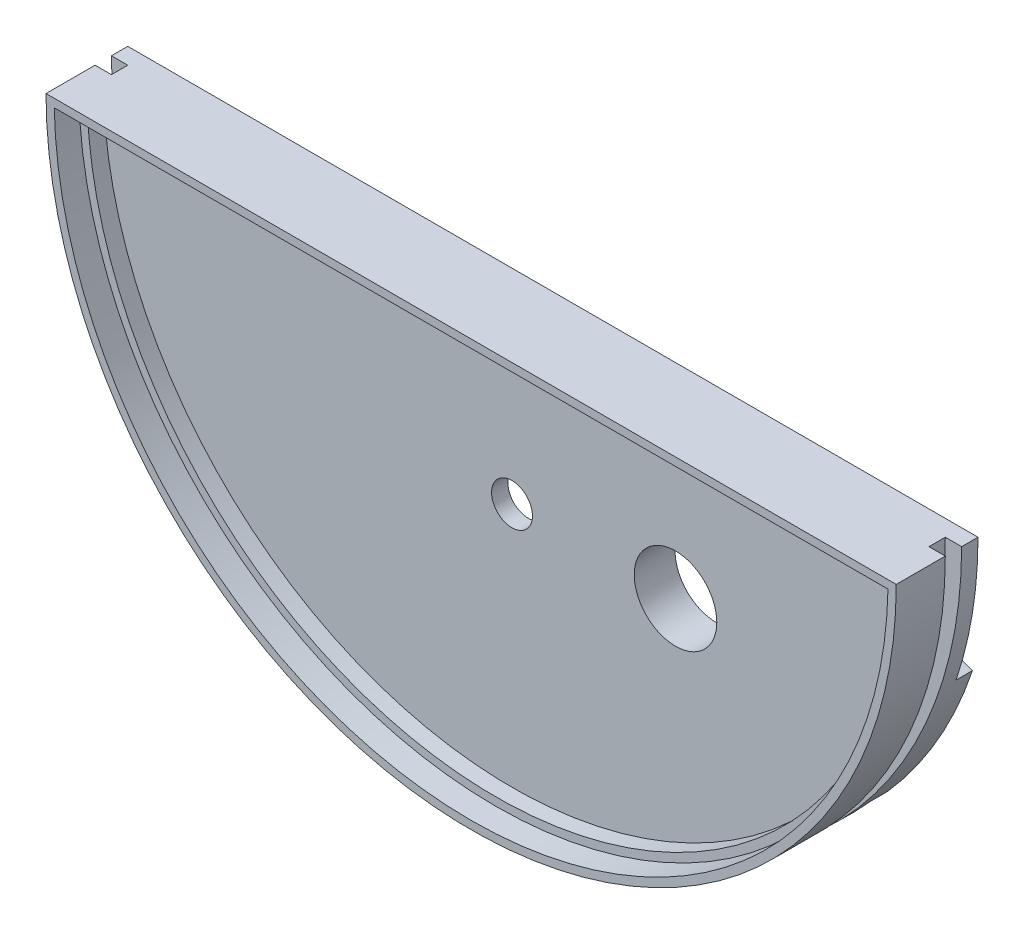
ISO-10303-21;
HEADER;
FILE_DESCRIPTION(('STEP AP214'),'2;1');
FILE_NAME('part.step','',(''),(''),'','','');
FILE_SCHEMA(('AUTOMOTIVE_DESIGN { 1 0 10303 214 1 1 1 1 }'));
ENDSEC;
DATA;
#1=APPLICATION_CONTEXT('core data for automotive mechanical design processes');
#2=APPLICATION_PROTOCOL_DEFINITION('international standard','automotive_design',2000,#1);
#3=PRODUCT_CONTEXT('',#1,'mechanical');
#4=PRODUCT('Part','Part','',(#3));
#5=PRODUCT_RELATED_PRODUCT_CATEGORY('part','',(#4));
#6=PRODUCT_DEFINITION_FORMATION('','',#4);
#7=PRODUCT_DEFINITION_CONTEXT('part definition',#1,'design');
#8=PRODUCT_DEFINITION('design','',#6,#7);
#9=PRODUCT_DEFINITION_SHAPE('','',#8);
#10=(LENGTH_UNIT() NAMED_UNIT(*) SI_UNIT(.MILLI.,.METRE.));
#11=(NAMED_UNIT(*) PLANE_ANGLE_UNIT() SI_UNIT($,.RADIAN.));
#12=(NAMED_UNIT(*) SI_UNIT($,.STERADIAN.) SOLID_ANGLE_UNIT());
#13=UNCERTAINTY_MEASURE_WITH_UNIT(LENGTH_MEASURE(1.E-05),#10,'distance_accuracy_value','');
#14=(GEOMETRIC_REPRESENTATION_CONTEXT(3) GLOBAL_UNCERTAINTY_ASSIGNED_CONTEXT((#13)) GLOBAL_UNIT_ASSIGNED_CONTEXT((#10,
#11,#12)) REPRESENTATION_CONTEXT('',''));
#15=CARTESIAN_POINT('',(0.,0.,0.));
#16=DIRECTION('',(0.,0.,1.));
#17=DIRECTION('',(1.,0.,0.));
#18=AXIS2_PLACEMENT_3D('',#15,#16,#17);
#19=CARTESIAN_POINT('',(0.,0.,-5.));
#20=DIRECTION('',(0.,0.,1.));
#21=DIRECTION('',(1.,0.,0.));
#22=AXIS2_PLACEMENT_3D('',#19,#20,#21);
#23=CYLINDRICAL_SURFACE('',#22,52.);
#24=DIRECTION('',(0.,0.,1.));
#25=VECTOR('',#24,1.);
#26=CARTESIAN_POINT('',(-52.,0.,-5.));
#27=LINE('',#26,#25);
#28=CARTESIAN_POINT('',(-52.,0.,-1.));
#29=VERTEX_POINT('',#28);
#30=CARTESIAN_POINT('',(-52.,0.,5.));
#31=VERTEX_POINT('',#30);
#32=EDGE_CURVE('E357',#29,#31,#27,.T.);
#33=ORIENTED_EDGE('',*,*,#32,.F.);
#34=CARTESIAN_POINT('',(0.,0.,-1.));
#35=DIRECTION('',(0.,0.,-1.));
#36=DIRECTION('',(-1.,0.,0.));
#37=AXIS2_PLACEMENT_3D('',#34,#35,#36);
#38=CIRCLE('',#37,52.);
#39=CARTESIAN_POINT('',(52.,0.,-1.));
#40=VERTEX_POINT('',#39);
#41=EDGE_CURVE('E51',#29,#40,#38,.F.);
#42=ORIENTED_EDGE('',*,*,#41,.T.);
#43=DIRECTION('',(0.,0.,1.));
#44=VECTOR('',#43,1.);
#45=CARTESIAN_POINT('',(52.,0.,-5.));
#46=LINE('',#45,#44);
#47=CARTESIAN_POINT('',(52.,0.,5.));
#48=VERTEX_POINT('',#47);
#49=EDGE_CURVE('E358',#40,#48,#46,.T.);
#50=ORIENTED_EDGE('',*,*,#49,.T.);
#51=CARTESIAN_POINT('',(0.,0.,5.));
#52=DIRECTION('',(0.,0.,1.));
#53=DIRECTION('',(1.,0.,0.));
#54=AXIS2_PLACEMENT_3D('',#51,#52,#53);
#55=CIRCLE('',#54,52.);
#56=EDGE_CURVE('E375',#31,#48,#55,.T.);
#57=ORIENTED_EDGE('',*,*,#56,.F.);
#58=EDGE_LOOP('',(#33,#42,#50,#57));
#59=FACE_BOUND('',#58,.T.);
#60=ADVANCED_FACE('F35',(#59),#23,.T.);
#61=CARTESIAN_POINT('',(0.,0.,5.));
#62=DIRECTION('',(0.,0.,-1.));
#63=DIRECTION('',(-1.,0.,0.));
#64=AXIS2_PLACEMENT_3D('',#61,#62,#63);
#65=CYLINDRICAL_SURFACE('',#64,50.);
#66=DIRECTION('',(0.,0.,-1.));
#67=VECTOR('',#66,1.);
#68=CARTESIAN_POINT('',(-49.9599839871872,-2.00000000000002,5.));
#69=LINE('',#68,#67);
#70=CARTESIAN_POINT('',(-49.9599839871872,-2.00000000000002,2.));
#71=VERTEX_POINT('',#70);
#72=CARTESIAN_POINT('',(-49.9599839871872,-2.00000000000002,0.));
#73=VERTEX_POINT('',#72);
#74=EDGE_CURVE('E379',#71,#73,#69,.T.);
#75=ORIENTED_EDGE('',*,*,#74,.F.);
#76=CARTESIAN_POINT('',(0.,0.,2.));
#77=DIRECTION('',(0.,0.,1.));
#78=DIRECTION('',(1.,0.,0.));
#79=AXIS2_PLACEMENT_3D('',#76,#77,#78);
#80=CIRCLE('',#79,50.);
#81=CARTESIAN_POINT('',(49.9599839871872,-2.,2.));
#82=VERTEX_POINT('',#81);
#83=EDGE_CURVE('E225',#71,#82,#80,.T.);
#84=ORIENTED_EDGE('',*,*,#83,.T.);
#85=DIRECTION('',(0.,0.,-1.));
#86=VECTOR('',#85,1.);
#87=CARTESIAN_POINT('',(49.9599839871872,-2.,5.));
#88=LINE('',#87,#86);
#89=CARTESIAN_POINT('',(49.9599839871872,-2.,0.));
#90=VERTEX_POINT('',#89);
#91=EDGE_CURVE('E377',#82,#90,#88,.T.);
#92=ORIENTED_EDGE('',*,*,#91,.T.);
#93=CARTESIAN_POINT('',(0.,0.,0.));
#94=DIRECTION('',(0.,0.,1.));
#95=DIRECTION('',(1.,0.,0.));
#96=AXIS2_PLACEMENT_3D('',#93,#94,#95);
#97=CIRCLE('',#96,50.);
#98=EDGE_CURVE('E470',#73,#90,#97,.T.);
#99=ORIENTED_EDGE('',*,*,#98,.F.);
#100=EDGE_LOOP('',(#75,#84,#92,#99));
#101=FACE_BOUND('',#100,.T.);
#102=ADVANCED_FACE('F405',(#101),#65,.F.);
#103=CARTESIAN_POINT('',(49.9599839871872,-2.,5.));
#104=DIRECTION('',(0.,-1.,0.));
#105=DIRECTION('',(1.,0.,0.));
#106=AXIS2_PLACEMENT_3D('',#103,#104,#105);
#107=PLANE('',#106);
#108=ORIENTED_EDGE('',*,*,#91,.F.);
#109=DIRECTION('',(-1.,0.,0.));
#110=VECTOR('',#109,1.);
#111=CARTESIAN_POINT('',(49.9599839871872,-2.,2.));
#112=LINE('',#111,#110);
#113=EDGE_CURVE('E364',#82,#71,#112,.T.);
#114=ORIENTED_EDGE('',*,*,#113,.T.);
#115=ORIENTED_EDGE('',*,*,#74,.T.);
#116=DIRECTION('',(-1.,0.,0.));
#117=VECTOR('',#116,1.);
#118=CARTESIAN_POINT('',(49.9599839871872,-2.,0.));
#119=LINE('',#118,#117);
#120=EDGE_CURVE('E492',#90,#73,#119,.T.);
#121=ORIENTED_EDGE('',*,*,#120,.F.);
#122=EDGE_LOOP('',(#108,#114,#115,#121));
#123=FACE_BOUND('',#122,.T.);
#124=ADVANCED_FACE('F409',(#123),#107,.T.);
#125=CARTESIAN_POINT('',(0.,0.,-5.));
#126=DIRECTION('',(0.,0.,1.));
#127=DIRECTION('',(1.,0.,0.));
#128=AXIS2_PLACEMENT_3D('',#125,#126,#127);
#129=PLANE('',#128);
#130=DIRECTION('',(-0.748528137423872,-0.663103029313507,0.));
#131=VECTOR('',#130,1.);
#132=CARTESIAN_POINT('',(7.03983839868184E-13,-7.94675471440051E-13,-5.));
#133=LINE('',#132,#131);
#134=CARTESIAN_POINT('',(-37.4264068711929,-33.1551514656761,-5.));
#135=VERTEX_POINT('',#134);
#136=CARTESIAN_POINT('',(-38.9234631460406,-34.4813575243032,-5.));
#137=VERTEX_POINT('',#136);
#138=EDGE_CURVE('E259',#135,#137,#133,.T.);
#139=ORIENTED_EDGE('',*,*,#138,.F.);
#140=CARTESIAN_POINT('',(0.,0.,-5.));
#141=DIRECTION('',(0.,0.,-1.));
#142=DIRECTION('',(-1.,0.,0.));
#143=AXIS2_PLACEMENT_3D('',#140,#141,#142);
#144=CIRCLE('',#143,50.);
#145=CARTESIAN_POINT('',(-47.4264068711929,-15.8346433899874,-5.));
#146=VERTEX_POINT('',#145);
#147=EDGE_CURVE('E242',#135,#146,#144,.T.);
#148=ORIENTED_EDGE('',*,*,#147,.T.);
#149=DIRECTION('',(-0.948528137423857,-0.316692867799747,0.));
#150=VECTOR('',#149,1.);
#151=CARTESIAN_POINT('',(0.,0.,-5.));
#152=LINE('',#151,#150);
#153=CARTESIAN_POINT('',(-49.3234631460406,-16.4680291255868,-5.));
#154=VERTEX_POINT('',#153);
#155=EDGE_CURVE('E249',#146,#154,#152,.T.);
#156=ORIENTED_EDGE('',*,*,#155,.T.);
#157=CARTESIAN_POINT('',(0.,0.,-5.));
#158=DIRECTION('',(0.,0.,1.));
#159=DIRECTION('',(1.,0.,0.));
#160=AXIS2_PLACEMENT_3D('',#157,#158,#159);
#161=CIRCLE('',#160,52.);
#162=CARTESIAN_POINT('',(-52.,0.,-5.));
#163=VERTEX_POINT('',#162);
#164=EDGE_CURVE('E353',#163,#154,#161,.T.);
#165=ORIENTED_EDGE('',*,*,#164,.F.);
#166=DIRECTION('',(-1.,0.,0.));
#167=VECTOR('',#166,1.);
#168=CARTESIAN_POINT('',(-52.,0.,-5.));
#169=LINE('',#168,#167);
#170=CARTESIAN_POINT('',(52.,0.,-5.));
#171=VERTEX_POINT('',#170);
#172=EDGE_CURVE('E348',#171,#163,#169,.T.);
#173=ORIENTED_EDGE('',*,*,#172,.F.);
#174=CARTESIAN_POINT('',(49.3234631460406,-16.4680291255869,-5.));
#175=VERTEX_POINT('',#174);
#176=EDGE_CURVE('E321',#175,#171,#161,.T.);
#177=ORIENTED_EDGE('',*,*,#176,.F.);
#178=DIRECTION('',(0.948528137423855,-0.316692867799755,0.));
#179=VECTOR('',#178,1.);
#180=CARTESIAN_POINT('',(1.18664903328477E-13,3.55413749964563E-13,-5.));
#181=LINE('',#180,#179);
#182=CARTESIAN_POINT('',(47.4264068711928,-15.8346433899874,-5.));
#183=VERTEX_POINT('',#182);
#184=EDGE_CURVE('E313',#183,#175,#181,.T.);
#185=ORIENTED_EDGE('',*,*,#184,.F.);
#186=CARTESIAN_POINT('',(0.,0.,-5.));
#187=DIRECTION('',(0.,0.,-1.));
#188=DIRECTION('',(-1.,0.,0.));
#189=AXIS2_PLACEMENT_3D('',#186,#187,#188);
#190=CIRCLE('',#189,50.);
#191=CARTESIAN_POINT('',(37.4264068711928,-33.1551514656762,-5.));
#192=VERTEX_POINT('',#191);
#193=EDGE_CURVE('E299',#183,#192,#190,.T.);
#194=ORIENTED_EDGE('',*,*,#193,.T.);
#195=DIRECTION('',(0.748528137423853,-0.663103029313527,0.));
#196=VECTOR('',#195,1.);
#197=CARTESIAN_POINT('',(1.7484565957511E-13,1.9737037852759E-13,-5.));
#198=LINE('',#197,#196);
#199=CARTESIAN_POINT('',(38.9234631460406,-34.4813575243032,-5.));
#200=VERTEX_POINT('',#199);
#201=EDGE_CURVE('E304',#192,#200,#198,.T.);
#202=ORIENTED_EDGE('',*,*,#201,.T.);
#203=CARTESIAN_POINT('',(10.4,-50.9493866498901,-5.));
#204=VERTEX_POINT('',#203);
#205=EDGE_CURVE('E339',#204,#200,#161,.T.);
#206=ORIENTED_EDGE('',*,*,#205,.F.);
#207=DIRECTION('',(0.199999999999982,-0.979795897113275,0.));
#208=VECTOR('',#207,1.);
#209=CARTESIAN_POINT('',(8.8383097108184E-13,1.80411241501572E-13,-5.));
#210=LINE('',#209,#208);
#211=CARTESIAN_POINT('',(10.,-48.9897948556635,-5.));
#212=VERTEX_POINT('',#211);
#213=EDGE_CURVE('E286',#212,#204,#210,.T.);
#214=ORIENTED_EDGE('',*,*,#213,.F.);
#215=CARTESIAN_POINT('',(0.,0.,-5.));
#216=DIRECTION('',(0.,0.,-1.));
#217=DIRECTION('',(-1.,0.,0.));
#218=AXIS2_PLACEMENT_3D('',#215,#216,#217);
#219=CIRCLE('',#218,50.);
#220=CARTESIAN_POINT('',(-10.,-48.9897948556636,-5.));
#221=VERTEX_POINT('',#220);
#222=EDGE_CURVE('E271',#212,#221,#219,.T.);
#223=ORIENTED_EDGE('',*,*,#222,.T.);
#224=DIRECTION('',(-0.200000000000004,-0.97979589711327,0.));
#225=VECTOR('',#224,1.);
#226=CARTESIAN_POINT('',(1.93762943660249E-13,0.,-5.));
#227=LINE('',#226,#225);
#228=CARTESIAN_POINT('',(-10.4,-50.9493866498901,-5.));
#229=VERTEX_POINT('',#228);
#230=EDGE_CURVE('E276',#221,#229,#227,.T.);
#231=ORIENTED_EDGE('',*,*,#230,.T.);
#232=EDGE_CURVE('E341',#137,#229,#161,.T.);
#233=ORIENTED_EDGE('',*,*,#232,.F.);
#234=EDGE_LOOP('',(#139,#148,#156,#165,#173,#177,#185,#194,#202,#206,#214,#223,#231,#233));
#235=FACE_BOUND('',#234,.T.);
#236=CARTESIAN_POINT('',(20.,-20.,-5.));
#237=DIRECTION('',(0.,0.,1.));
#238=DIRECTION('',(1.,0.,0.));
#239=AXIS2_PLACEMENT_3D('',#236,#237,#238);
#240=CIRCLE('',#239,5.05);
#241=CARTESIAN_POINT('',(25.05,-20.,-5.));
#242=VERTEX_POINT('',#241);
#243=EDGE_CURVE('E382',#242,#242,#240,.T.);
#244=ORIENTED_EDGE('',*,*,#243,.T.);
#245=EDGE_LOOP('',(#244));
#246=FACE_BOUND('',#245,.T.);
#247=CARTESIAN_POINT('',(0.,-20.,-5.));
#248=DIRECTION('',(0.,0.,-1.));
#249=DIRECTION('',(-1.,0.,0.));
#250=AXIS2_PLACEMENT_3D('',#247,#248,#249);
#251=CIRCLE('',#250,9.5);
#252=CARTESIAN_POINT('',(-9.5,-20.,-5.));
#253=VERTEX_POINT('',#252);
#254=EDGE_CURVE('E238',#253,#253,#251,.T.);
#255=ORIENTED_EDGE('',*,*,#254,.F.);
#256=EDGE_LOOP('',(#255));
#257=FACE_BOUND('',#256,.T.);
#258=CARTESIAN_POINT('',(-20.,-20.,-5.));
#259=DIRECTION('',(0.,0.,1.));
#260=DIRECTION('',(1.,0.,0.));
#261=AXIS2_PLACEMENT_3D('',#258,#259,#260);
#262=CIRCLE('',#261,5.);
#263=CARTESIAN_POINT('',(-15.,-20.,-5.));
#264=VERTEX_POINT('',#263);
#265=EDGE_CURVE('E361',#264,#264,#262,.F.);
#266=ORIENTED_EDGE('',*,*,#265,.F.);
#267=EDGE_LOOP('',(#266));
#268=FACE_BOUND('',#267,.T.);
#269=ADVANCED_FACE('F413',(#235,#246,#257,#268),#129,.F.);
#270=CARTESIAN_POINT('',(0.,0.,-3.));
#271=DIRECTION('',(0.,0.,-1.));
#272=DIRECTION('',(-1.,0.,0.));
#273=AXIS2_PLACEMENT_3D('',#270,#271,#272);
#274=CIRCLE('',#273,52.);
#275=CARTESIAN_POINT('',(-52.,3.63114059239686E-13,-3.));
#276=VERTEX_POINT('',#275);
#277=CARTESIAN_POINT('',(52.,0.,-3.));
#278=VERTEX_POINT('',#277);
#279=EDGE_CURVE('E188',#276,#278,#274,.F.);
#280=ORIENTED_EDGE('',*,*,#279,.F.);
#281=EDGE_CURVE('E359',#163,#276,#27,.T.);
#282=ORIENTED_EDGE('',*,*,#281,.F.);
#283=ORIENTED_EDGE('',*,*,#164,.T.);
#284=DIRECTION('',(0.,0.,1.));
#285=VECTOR('',#284,1.);
#286=CARTESIAN_POINT('',(-49.3234631460406,-16.4680291255868,-7.));
#287=LINE('',#286,#285);
#288=CARTESIAN_POINT('',(-49.3234631460406,-16.4680291255868,-7.));
#289=VERTEX_POINT('',#288);
#290=EDGE_CURVE('E265',#289,#154,#287,.T.);
#291=ORIENTED_EDGE('',*,*,#290,.F.);
#292=CARTESIAN_POINT('',(0.,0.,-7.));
#293=DIRECTION('',(0.,0.,-1.));
#294=DIRECTION('',(-1.,0.,0.));
#295=AXIS2_PLACEMENT_3D('',#292,#293,#294);
#296=CIRCLE('',#295,52.);
#297=CARTESIAN_POINT('',(-38.9234631460406,-34.4813575243032,-7.));
#298=VERTEX_POINT('',#297);
#299=EDGE_CURVE('E251',#298,#289,#296,.T.);
#300=ORIENTED_EDGE('',*,*,#299,.F.);
#301=DIRECTION('',(0.,0.,1.));
#302=VECTOR('',#301,1.);
#303=CARTESIAN_POINT('',(-38.9234631460406,-34.4813575243032,-7.));
#304=LINE('',#303,#302);
#305=EDGE_CURVE('E267',#298,#137,#304,.T.);
#306=ORIENTED_EDGE('',*,*,#305,.T.);
#307=ORIENTED_EDGE('',*,*,#232,.T.);
#308=DIRECTION('',(0.,0.,1.));
#309=VECTOR('',#308,1.);
#310=CARTESIAN_POINT('',(-10.4,-50.9493866498901,-7.));
#311=LINE('',#310,#309);
#312=CARTESIAN_POINT('',(-10.4,-50.9493866498901,-7.));
#313=VERTEX_POINT('',#312);
#314=EDGE_CURVE('E291',#313,#229,#311,.T.);
#315=ORIENTED_EDGE('',*,*,#314,.F.);
#316=CARTESIAN_POINT('',(0.,0.,-7.));
#317=DIRECTION('',(0.,0.,-1.));
#318=DIRECTION('',(-1.,0.,0.));
#319=AXIS2_PLACEMENT_3D('',#316,#317,#318);
#320=CIRCLE('',#319,52.);
#321=CARTESIAN_POINT('',(10.4,-50.9493866498901,-7.));
#322=VERTEX_POINT('',#321);
#323=EDGE_CURVE('E278',#322,#313,#320,.T.);
#324=ORIENTED_EDGE('',*,*,#323,.F.);
#325=DIRECTION('',(0.,0.,1.));
#326=VECTOR('',#325,1.);
#327=CARTESIAN_POINT('',(10.4,-50.9493866498901,-7.));
#328=LINE('',#327,#326);
#329=EDGE_CURVE('E294',#322,#204,#328,.T.);
#330=ORIENTED_EDGE('',*,*,#329,.T.);
#331=ORIENTED_EDGE('',*,*,#205,.T.);
#332=DIRECTION('',(0.,0.,1.));
#333=VECTOR('',#332,1.);
#334=CARTESIAN_POINT('',(38.9234631460406,-34.4813575243032,-7.));
#335=LINE('',#334,#333);
#336=CARTESIAN_POINT('',(38.9234631460406,-34.4813575243032,-7.));
#337=VERTEX_POINT('',#336);
#338=EDGE_CURVE('E328',#337,#200,#335,.T.);
#339=ORIENTED_EDGE('',*,*,#338,.F.);
#340=CARTESIAN_POINT('',(0.,0.,-7.));
#341=DIRECTION('',(0.,0.,-1.));
#342=DIRECTION('',(-1.,0.,0.));
#343=AXIS2_PLACEMENT_3D('',#340,#341,#342);
#344=CIRCLE('',#343,52.);
#345=CARTESIAN_POINT('',(49.3234631460406,-16.4680291255869,-7.));
#346=VERTEX_POINT('',#345);
#347=EDGE_CURVE('E306',#346,#337,#344,.T.);
#348=ORIENTED_EDGE('',*,*,#347,.F.);
#349=DIRECTION('',(0.,0.,1.));
#350=VECTOR('',#349,1.);
#351=CARTESIAN_POINT('',(49.3234631460406,-16.4680291255869,-7.));
#352=LINE('',#351,#350);
#353=EDGE_CURVE('E324',#346,#175,#352,.T.);
#354=ORIENTED_EDGE('',*,*,#353,.T.);
#355=ORIENTED_EDGE('',*,*,#176,.T.);
#356=EDGE_CURVE('E356',#171,#278,#46,.T.);
#357=ORIENTED_EDGE('',*,*,#356,.T.);
#358=EDGE_LOOP('',(#280,#282,#283,#291,#300,#306,#307,#315,#324,#330,#331,#339,#348,#354,#355,#357));
#359=FACE_BOUND('',#358,.T.);
#360=ADVANCED_FACE('F37',(#359),#23,.T.);
#361=CARTESIAN_POINT('',(-52.,0.,-5.));
#362=DIRECTION('',(0.,1.,0.));
#363=DIRECTION('',(0.,0.,1.));
#364=AXIS2_PLACEMENT_3D('',#361,#362,#363);
#365=PLANE('',#364);
#366=DIRECTION('',(-1.,0.,0.));
#367=VECTOR('',#366,1.);
#368=CARTESIAN_POINT('',(-52.,0.,-3.));
#369=LINE('',#368,#367);
#370=CARTESIAN_POINT('',(50.,0.,-3.));
#371=VERTEX_POINT('',#370);
#372=EDGE_CURVE('E11',#278,#371,#369,.T.);
#373=ORIENTED_EDGE('',*,*,#372,.F.);
#374=ORIENTED_EDGE('',*,*,#356,.F.);
#375=ORIENTED_EDGE('',*,*,#172,.T.);
#376=ORIENTED_EDGE('',*,*,#281,.T.);
#377=CARTESIAN_POINT('',(-50.,3.49148133884313E-13,-3.));
#378=VERTEX_POINT('',#377);
#379=EDGE_CURVE('E39',#378,#276,#369,.T.);
#380=ORIENTED_EDGE('',*,*,#379,.F.);
#381=DIRECTION('',(0.,0.,-1.));
#382=VECTOR('',#381,1.);
#383=CARTESIAN_POINT('',(-50.,3.49148133884313E-13,-0.999999999999999));
#384=LINE('',#383,#382);
#385=CARTESIAN_POINT('',(-50.,3.49148133884313E-13,-0.999999999999999));
#386=VERTEX_POINT('',#385);
#387=EDGE_CURVE('E200',#386,#378,#384,.T.);
#388=ORIENTED_EDGE('',*,*,#387,.F.);
#389=DIRECTION('',(-1.,0.,0.));
#390=VECTOR('',#389,1.);
#391=CARTESIAN_POINT('',(-52.,0.,-1.));
#392=LINE('',#391,#390);
#393=EDGE_CURVE('E370',#386,#29,#392,.T.);
#394=ORIENTED_EDGE('',*,*,#393,.T.);
#395=ORIENTED_EDGE('',*,*,#32,.T.);
#396=DIRECTION('',(-1.,0.,0.));
#397=VECTOR('',#396,1.);
#398=CARTESIAN_POINT('',(52.,0.,5.));
#399=LINE('',#398,#397);
#400=EDGE_CURVE('E368',#48,#31,#399,.T.);
#401=ORIENTED_EDGE('',*,*,#400,.F.);
#402=ORIENTED_EDGE('',*,*,#49,.F.);
#403=CARTESIAN_POINT('',(50.,0.,-0.999999999999999));
#404=VERTEX_POINT('',#403);
#405=EDGE_CURVE('E44',#40,#404,#392,.T.);
#406=ORIENTED_EDGE('',*,*,#405,.T.);
#407=DIRECTION('',(0.,0.,-1.));
#408=VECTOR('',#407,1.);
#409=CARTESIAN_POINT('',(50.,0.,-0.999999999999999));
#410=LINE('',#409,#408);
#411=EDGE_CURVE('E197',#404,#371,#410,.T.);
#412=ORIENTED_EDGE('',*,*,#411,.T.);
#413=EDGE_LOOP('',(#373,#374,#375,#376,#380,#388,#394,#395,#401,#402,#406,#412));
#414=FACE_BOUND('',#413,.T.);
#415=ADVANCED_FACE('F204',(#414),#365,.T.);
#416=CARTESIAN_POINT('',(0.,0.,0.));
#417=DIRECTION('',(0.,0.,1.));
#418=DIRECTION('',(1.,0.,0.));
#419=AXIS2_PLACEMENT_3D('',#416,#417,#418);
#420=PLANE('',#419);
#421=CARTESIAN_POINT('',(0.,-20.,0.));
#422=DIRECTION('',(0.,0.,1.));
#423=DIRECTION('',(1.,0.,0.));
#424=AXIS2_PLACEMENT_3D('',#421,#422,#423);
#425=CIRCLE('',#424,2.5);
#426=CARTESIAN_POINT('',(2.5,-20.,0.));
#427=VERTEX_POINT('',#426);
#428=EDGE_CURVE('E235',#427,#427,#425,.T.);
#429=ORIENTED_EDGE('',*,*,#428,.F.);
#430=EDGE_LOOP('',(#429));
#431=FACE_BOUND('',#430,.T.);
#432=ORIENTED_EDGE('',*,*,#98,.T.);
#433=ORIENTED_EDGE('',*,*,#120,.T.);
#434=EDGE_LOOP('',(#432,#433));
#435=FACE_BOUND('',#434,.T.);
#436=CARTESIAN_POINT('',(20.,-20.,0.));
#437=DIRECTION('',(0.,0.,1.));
#438=DIRECTION('',(1.,0.,0.));
#439=AXIS2_PLACEMENT_3D('',#436,#437,#438);
#440=CIRCLE('',#439,5.05);
#441=CARTESIAN_POINT('',(25.05,-20.,0.));
#442=VERTEX_POINT('',#441);
#443=EDGE_CURVE('E346',#442,#442,#440,.T.);
#444=ORIENTED_EDGE('',*,*,#443,.F.);
#445=EDGE_LOOP('',(#444));
#446=FACE_BOUND('',#445,.T.);
#447=ADVANCED_FACE('F391',(#431,#435,#446),#420,.T.);
#448=CARTESIAN_POINT('',(20.,-20.,-5.));
#449=DIRECTION('',(0.,0.,1.));
#450=DIRECTION('',(1.,0.,0.));
#451=AXIS2_PLACEMENT_3D('',#448,#449,#450);
#452=CYLINDRICAL_SURFACE('',#451,5.05);
#453=ORIENTED_EDGE('',*,*,#243,.F.);
#454=EDGE_LOOP('',(#453));
#455=FACE_BOUND('',#454,.T.);
#456=ORIENTED_EDGE('',*,*,#443,.T.);
#457=EDGE_LOOP('',(#456));
#458=FACE_BOUND('',#457,.T.);
#459=ADVANCED_FACE('F389',(#455,#458),#452,.F.);
#460=CARTESIAN_POINT('',(0.,0.,5.));
#461=DIRECTION('',(0.,0.,1.));
#462=DIRECTION('',(1.,0.,0.));
#463=AXIS2_PLACEMENT_3D('',#460,#461,#462);
#464=PLANE('',#463);
#465=DIRECTION('',(-1.,0.,0.));
#466=VECTOR('',#465,1.);
#467=CARTESIAN_POINT('',(0.,-1.00000000000001,5.));
#468=LINE('',#467,#466);
#469=CARTESIAN_POINT('',(50.9901951359278,-0.999999999999999,5.));
#470=VERTEX_POINT('',#469);
#471=CARTESIAN_POINT('',(-50.9901951359278,-1.00000000000002,5.));
#472=VERTEX_POINT('',#471);
#473=EDGE_CURVE('E59',#470,#472,#468,.T.);
#474=ORIENTED_EDGE('',*,*,#473,.F.);
#475=CARTESIAN_POINT('',(0.,0.,5.));
#476=DIRECTION('',(0.,0.,1.));
#477=DIRECTION('',(1.,0.,0.));
#478=AXIS2_PLACEMENT_3D('',#475,#476,#477);
#479=CIRCLE('',#478,51.);
#480=EDGE_CURVE('E216',#472,#470,#479,.T.);
#481=ORIENTED_EDGE('',*,*,#480,.F.);
#482=EDGE_LOOP('',(#474,#481));
#483=FACE_BOUND('',#482,.T.);
#484=ORIENTED_EDGE('',*,*,#56,.T.);
#485=ORIENTED_EDGE('',*,*,#400,.T.);
#486=EDGE_LOOP('',(#484,#485));
#487=FACE_BOUND('',#486,.T.);
#488=ADVANCED_FACE('F374',(#483,#487),#464,.T.);
#489=CARTESIAN_POINT('',(0.,0.,-7.));
#490=DIRECTION('',(0.,0.,1.));
#491=DIRECTION('',(1.,0.,0.));
#492=AXIS2_PLACEMENT_3D('',#489,#490,#491);
#493=CYLINDRICAL_SURFACE('',#492,50.);
#494=ORIENTED_EDGE('',*,*,#193,.F.);
#495=DIRECTION('',(0.,0.,1.));
#496=VECTOR('',#495,1.);
#497=CARTESIAN_POINT('',(47.4264068711928,-15.8346433899874,-7.));
#498=LINE('',#497,#496);
#499=CARTESIAN_POINT('',(47.4264068711928,-15.8346433899874,-7.));
#500=VERTEX_POINT('',#499);
#501=EDGE_CURVE('E327',#500,#183,#498,.T.);
#502=ORIENTED_EDGE('',*,*,#501,.F.);
#503=CARTESIAN_POINT('',(0.,0.,-7.));
#504=DIRECTION('',(0.,0.,-1.));
#505=DIRECTION('',(-1.,0.,0.));
#506=AXIS2_PLACEMENT_3D('',#503,#504,#505);
#507=CIRCLE('',#506,50.);
#508=CARTESIAN_POINT('',(37.4264068711928,-33.1551514656762,-7.));
#509=VERTEX_POINT('',#508);
#510=EDGE_CURVE('E300',#500,#509,#507,.T.);
#511=ORIENTED_EDGE('',*,*,#510,.T.);
#512=DIRECTION('',(0.,0.,1.));
#513=VECTOR('',#512,1.);
#514=CARTESIAN_POINT('',(37.4264068711928,-33.1551514656762,-7.));
#515=LINE('',#514,#513);
#516=EDGE_CURVE('E311',#509,#192,#515,.T.);
#517=ORIENTED_EDGE('',*,*,#516,.T.);
#518=EDGE_LOOP('',(#494,#502,#511,#517));
#519=FACE_BOUND('',#518,.T.);
#520=ADVANCED_FACE('F471',(#519),#493,.F.);
#521=CARTESIAN_POINT('',(1.18664903328477E-13,3.55413749964563E-13,-7.));
#522=DIRECTION('',(-0.316692867799755,-0.948528137423855,0.));
#523=DIRECTION('',(0.948528137423855,-0.316692867799755,0.));
#524=AXIS2_PLACEMENT_3D('',#521,#522,#523);
#525=PLANE('',#524);
#526=ORIENTED_EDGE('',*,*,#184,.T.);
#527=ORIENTED_EDGE('',*,*,#353,.F.);
#528=DIRECTION('',(0.948528137423855,-0.316692867799755,0.));
#529=VECTOR('',#528,1.);
#530=CARTESIAN_POINT('',(1.18664903328477E-13,3.55413749964563E-13,-7.));
#531=LINE('',#530,#529);
#532=EDGE_CURVE('E303',#500,#346,#531,.T.);
#533=ORIENTED_EDGE('',*,*,#532,.F.);
#534=ORIENTED_EDGE('',*,*,#501,.T.);
#535=EDGE_LOOP('',(#526,#527,#533,#534));
#536=FACE_BOUND('',#535,.T.);
#537=ADVANCED_FACE('F468',(#536),#525,.F.);
#538=CARTESIAN_POINT('',(1.7484565957511E-13,1.9737037852759E-13,-7.));
#539=DIRECTION('',(-0.663103029313527,-0.748528137423853,0.));
#540=DIRECTION('',(0.748528137423853,-0.663103029313527,0.));
#541=AXIS2_PLACEMENT_3D('',#538,#539,#540);
#542=PLANE('',#541);
#543=ORIENTED_EDGE('',*,*,#201,.F.);
#544=ORIENTED_EDGE('',*,*,#516,.F.);
#545=DIRECTION('',(0.748528137423853,-0.663103029313527,0.));
#546=VECTOR('',#545,1.);
#547=CARTESIAN_POINT('',(1.7484565957511E-13,1.9737037852759E-13,-7.));
#548=LINE('',#547,#546);
#549=EDGE_CURVE('E308',#509,#337,#548,.T.);
#550=ORIENTED_EDGE('',*,*,#549,.T.);
#551=ORIENTED_EDGE('',*,*,#338,.T.);
#552=EDGE_LOOP('',(#543,#544,#550,#551));
#553=FACE_BOUND('',#552,.T.);
#554=ADVANCED_FACE('F458',(#553),#542,.T.);
#555=CARTESIAN_POINT('',(0.,0.,-7.));
#556=DIRECTION('',(0.,0.,-1.));
#557=DIRECTION('',(-1.,0.,0.));
#558=AXIS2_PLACEMENT_3D('',#555,#556,#557);
#559=PLANE('',#558);
#560=ORIENTED_EDGE('',*,*,#510,.F.);
#561=ORIENTED_EDGE('',*,*,#532,.T.);
#562=ORIENTED_EDGE('',*,*,#347,.T.);
#563=ORIENTED_EDGE('',*,*,#549,.F.);
#564=EDGE_LOOP('',(#560,#561,#562,#563));
#565=FACE_BOUND('',#564,.T.);
#566=ADVANCED_FACE('F464',(#565),#559,.T.);
#567=CARTESIAN_POINT('',(0.,0.,-7.));
#568=DIRECTION('',(0.,0.,1.));
#569=DIRECTION('',(1.,0.,0.));
#570=AXIS2_PLACEMENT_3D('',#567,#568,#569);
#571=CYLINDRICAL_SURFACE('',#570,50.);
#572=ORIENTED_EDGE('',*,*,#222,.F.);
#573=DIRECTION('',(0.,0.,1.));
#574=VECTOR('',#573,1.);
#575=CARTESIAN_POINT('',(10.,-48.9897948556635,-7.));
#576=LINE('',#575,#574);
#577=CARTESIAN_POINT('',(10.,-48.9897948556635,-7.));
#578=VERTEX_POINT('',#577);
#579=EDGE_CURVE('E297',#578,#212,#576,.T.);
#580=ORIENTED_EDGE('',*,*,#579,.F.);
#581=CARTESIAN_POINT('',(0.,0.,-7.));
#582=DIRECTION('',(0.,0.,-1.));
#583=DIRECTION('',(-1.,0.,0.));
#584=AXIS2_PLACEMENT_3D('',#581,#582,#583);
#585=CIRCLE('',#584,50.);
#586=CARTESIAN_POINT('',(-10.,-48.9897948556636,-7.));
#587=VERTEX_POINT('',#586);
#588=EDGE_CURVE('E272',#578,#587,#585,.T.);
#589=ORIENTED_EDGE('',*,*,#588,.T.);
#590=DIRECTION('',(0.,0.,1.));
#591=VECTOR('',#590,1.);
#592=CARTESIAN_POINT('',(-10.,-48.9897948556636,-7.));
#593=LINE('',#592,#591);
#594=EDGE_CURVE('E283',#587,#221,#593,.T.);
#595=ORIENTED_EDGE('',*,*,#594,.T.);
#596=EDGE_LOOP('',(#572,#580,#589,#595));
#597=FACE_BOUND('',#596,.T.);
#598=ADVANCED_FACE('F446',(#597),#571,.F.);
#599=CARTESIAN_POINT('',(8.8383097108184E-13,1.80411241501572E-13,-7.));
#600=DIRECTION('',(-0.979795897113275,-0.199999999999982,0.));
#601=DIRECTION('',(0.199999999999982,-0.979795897113275,0.));
#602=AXIS2_PLACEMENT_3D('',#599,#600,#601);
#603=PLANE('',#602);
#604=ORIENTED_EDGE('',*,*,#213,.T.);
#605=ORIENTED_EDGE('',*,*,#329,.F.);
#606=DIRECTION('',(0.199999999999982,-0.979795897113275,0.));
#607=VECTOR('',#606,1.);
#608=CARTESIAN_POINT('',(8.8383097108184E-13,1.80411241501572E-13,-7.));
#609=LINE('',#608,#607);
#610=EDGE_CURVE('E275',#578,#322,#609,.T.);
#611=ORIENTED_EDGE('',*,*,#610,.F.);
#612=ORIENTED_EDGE('',*,*,#579,.T.);
#613=EDGE_LOOP('',(#604,#605,#611,#612));
#614=FACE_BOUND('',#613,.T.);
#615=ADVANCED_FACE('F550',(#614),#603,.F.);
#616=CARTESIAN_POINT('',(1.93762943660249E-13,0.,-7.));
#617=DIRECTION('',(-0.979795897113271,0.200000000000004,0.));
#618=DIRECTION('',(-0.200000000000004,-0.979795897113271,0.));
#619=AXIS2_PLACEMENT_3D('',#616,#617,#618);
#620=PLANE('',#619);
#621=ORIENTED_EDGE('',*,*,#230,.F.);
#622=ORIENTED_EDGE('',*,*,#594,.F.);
#623=DIRECTION('',(-0.200000000000004,-0.97979589711327,0.));
#624=VECTOR('',#623,1.);
#625=CARTESIAN_POINT('',(1.93762943660249E-13,0.,-7.));
#626=LINE('',#625,#624);
#627=EDGE_CURVE('E280',#587,#313,#626,.T.);
#628=ORIENTED_EDGE('',*,*,#627,.T.);
#629=ORIENTED_EDGE('',*,*,#314,.T.);
#630=EDGE_LOOP('',(#621,#622,#628,#629));
#631=FACE_BOUND('',#630,.T.);
#632=ADVANCED_FACE('F440',(#631),#620,.T.);
#633=CARTESIAN_POINT('',(0.,0.,-7.));
#634=DIRECTION('',(0.,0.,-1.));
#635=DIRECTION('',(-1.,0.,0.));
#636=AXIS2_PLACEMENT_3D('',#633,#634,#635);
#637=PLANE('',#636);
#638=ORIENTED_EDGE('',*,*,#588,.F.);
#639=ORIENTED_EDGE('',*,*,#610,.T.);
#640=ORIENTED_EDGE('',*,*,#323,.T.);
#641=ORIENTED_EDGE('',*,*,#627,.F.);
#642=EDGE_LOOP('',(#638,#639,#640,#641));
#643=FACE_BOUND('',#642,.T.);
#644=ADVANCED_FACE('F450',(#643),#637,.T.);
#645=CARTESIAN_POINT('',(0.,0.,-7.));
#646=DIRECTION('',(0.,0.,1.));
#647=DIRECTION('',(1.,0.,0.));
#648=AXIS2_PLACEMENT_3D('',#645,#646,#647);
#649=CYLINDRICAL_SURFACE('',#648,50.);
#650=ORIENTED_EDGE('',*,*,#147,.F.);
#651=DIRECTION('',(0.,0.,1.));
#652=VECTOR('',#651,1.);
#653=CARTESIAN_POINT('',(-37.4264068711929,-33.1551514656761,-7.));
#654=LINE('',#653,#652);
#655=CARTESIAN_POINT('',(-37.4264068711929,-33.1551514656761,-7.));
#656=VERTEX_POINT('',#655);
#657=EDGE_CURVE('E269',#656,#135,#654,.T.);
#658=ORIENTED_EDGE('',*,*,#657,.F.);
#659=CARTESIAN_POINT('',(0.,0.,-7.));
#660=DIRECTION('',(0.,0.,-1.));
#661=DIRECTION('',(-1.,0.,0.));
#662=AXIS2_PLACEMENT_3D('',#659,#660,#661);
#663=CIRCLE('',#662,50.);
#664=CARTESIAN_POINT('',(-47.4264068711929,-15.8346433899874,-7.));
#665=VERTEX_POINT('',#664);
#666=EDGE_CURVE('E245',#656,#665,#663,.T.);
#667=ORIENTED_EDGE('',*,*,#666,.T.);
#668=DIRECTION('',(0.,0.,1.));
#669=VECTOR('',#668,1.);
#670=CARTESIAN_POINT('',(-47.4264068711929,-15.8346433899874,-7.));
#671=LINE('',#670,#669);
#672=EDGE_CURVE('E256',#665,#146,#671,.T.);
#673=ORIENTED_EDGE('',*,*,#672,.T.);
#674=EDGE_LOOP('',(#650,#658,#667,#673));
#675=FACE_BOUND('',#674,.T.);
#676=ADVANCED_FACE('F542',(#675),#649,.F.);
#677=CARTESIAN_POINT('',(7.03983839868184E-13,-7.94675471440051E-13,-7.));
#678=DIRECTION('',(-0.663103029313507,0.748528137423872,0.));
#679=DIRECTION('',(-0.748528137423872,-0.663103029313507,0.));
#680=AXIS2_PLACEMENT_3D('',#677,#678,#679);
#681=PLANE('',#680);
#682=ORIENTED_EDGE('',*,*,#138,.T.);
#683=ORIENTED_EDGE('',*,*,#305,.F.);
#684=DIRECTION('',(-0.748528137423872,-0.663103029313507,0.));
#685=VECTOR('',#684,1.);
#686=CARTESIAN_POINT('',(7.03983839868184E-13,-7.94675471440051E-13,-7.));
#687=LINE('',#686,#685);
#688=EDGE_CURVE('E248',#656,#298,#687,.T.);
#689=ORIENTED_EDGE('',*,*,#688,.F.);
#690=ORIENTED_EDGE('',*,*,#657,.T.);
#691=EDGE_LOOP('',(#682,#683,#689,#690));
#692=FACE_BOUND('',#691,.T.);
#693=ADVANCED_FACE('F434',(#692),#681,.F.);
#694=CARTESIAN_POINT('',(0.,0.,-7.));
#695=DIRECTION('',(-0.316692867799747,0.948528137423857,0.));
#696=DIRECTION('',(-0.948528137423857,-0.316692867799747,0.));
#697=AXIS2_PLACEMENT_3D('',#694,#695,#696);
#698=PLANE('',#697);
#699=ORIENTED_EDGE('',*,*,#155,.F.);
#700=ORIENTED_EDGE('',*,*,#672,.F.);
#701=DIRECTION('',(-0.948528137423857,-0.316692867799747,0.));
#702=VECTOR('',#701,1.);
#703=CARTESIAN_POINT('',(0.,0.,-7.));
#704=LINE('',#703,#702);
#705=EDGE_CURVE('E253',#665,#289,#704,.T.);
#706=ORIENTED_EDGE('',*,*,#705,.T.);
#707=ORIENTED_EDGE('',*,*,#290,.T.);
#708=EDGE_LOOP('',(#699,#700,#706,#707));
#709=FACE_BOUND('',#708,.T.);
#710=ADVANCED_FACE('F427',(#709),#698,.T.);
#711=CARTESIAN_POINT('',(0.,0.,-7.));
#712=DIRECTION('',(0.,0.,-1.));
#713=DIRECTION('',(-1.,0.,0.));
#714=AXIS2_PLACEMENT_3D('',#711,#712,#713);
#715=PLANE('',#714);
#716=ORIENTED_EDGE('',*,*,#666,.F.);
#717=ORIENTED_EDGE('',*,*,#688,.T.);
#718=ORIENTED_EDGE('',*,*,#299,.T.);
#719=ORIENTED_EDGE('',*,*,#705,.F.);
#720=EDGE_LOOP('',(#716,#717,#718,#719));
#721=FACE_BOUND('',#720,.T.);
#722=ADVANCED_FACE('F430',(#721),#715,.T.);
#723=CARTESIAN_POINT('',(0.,-20.,-2.));
#724=DIRECTION('',(0.,0.,-1.));
#725=DIRECTION('',(-1.,0.,0.));
#726=AXIS2_PLACEMENT_3D('',#723,#724,#725);
#727=CYLINDRICAL_SURFACE('',#726,9.5);
#728=CARTESIAN_POINT('',(0.,-20.,-2.));
#729=DIRECTION('',(0.,0.,-1.));
#730=DIRECTION('',(-1.,0.,0.));
#731=AXIS2_PLACEMENT_3D('',#728,#729,#730);
#732=CIRCLE('',#731,9.5);
#733=CARTESIAN_POINT('',(-9.5,-20.,-2.));
#734=VERTEX_POINT('',#733);
#735=EDGE_CURVE('E239',#734,#734,#732,.T.);
#736=ORIENTED_EDGE('',*,*,#735,.F.);
#737=EDGE_LOOP('',(#736));
#738=FACE_BOUND('',#737,.T.);
#739=ORIENTED_EDGE('',*,*,#254,.T.);
#740=EDGE_LOOP('',(#739));
#741=FACE_BOUND('',#740,.T.);
#742=ADVANCED_FACE('F531',(#738,#741),#727,.F.);
#743=CARTESIAN_POINT('',(0.,-20.,-2.));
#744=DIRECTION('',(0.,0.,-1.));
#745=DIRECTION('',(-1.,0.,0.));
#746=AXIS2_PLACEMENT_3D('',#743,#744,#745);
#747=PLANE('',#746);
#748=CARTESIAN_POINT('',(0.,-20.,-2.));
#749=DIRECTION('',(0.,0.,-1.));
#750=DIRECTION('',(-1.,0.,0.));
#751=AXIS2_PLACEMENT_3D('',#748,#749,#750);
#752=CIRCLE('',#751,2.5);
#753=CARTESIAN_POINT('',(-2.5,-20.,-2.));
#754=VERTEX_POINT('',#753);
#755=EDGE_CURVE('E232',#754,#754,#752,.T.);
#756=ORIENTED_EDGE('',*,*,#755,.F.);
#757=EDGE_LOOP('',(#756));
#758=FACE_BOUND('',#757,.T.);
#759=ORIENTED_EDGE('',*,*,#735,.T.);
#760=EDGE_LOOP('',(#759));
#761=FACE_BOUND('',#760,.T.);
#762=ADVANCED_FACE('F527',(#758,#761),#747,.T.);
#763=CARTESIAN_POINT('',(0.,-20.,5.));
#764=DIRECTION('',(0.,0.,-1.));
#765=DIRECTION('',(-1.,0.,0.));
#766=AXIS2_PLACEMENT_3D('',#763,#764,#765);
#767=CYLINDRICAL_SURFACE('',#766,2.5);
#768=ORIENTED_EDGE('',*,*,#428,.T.);
#769=EDGE_LOOP('',(#768));
#770=FACE_BOUND('',#769,.T.);
#771=ORIENTED_EDGE('',*,*,#755,.T.);
#772=EDGE_LOOP('',(#771));
#773=FACE_BOUND('',#772,.T.);
#774=ADVANCED_FACE('F523',(#770,#773),#767,.F.);
#775=CARTESIAN_POINT('',(-20.,-20.,-8.));
#776=DIRECTION('',(0.,0.,1.));
#777=DIRECTION('',(1.,0.,0.));
#778=AXIS2_PLACEMENT_3D('',#775,#776,#777);
#779=CYLINDRICAL_SURFACE('',#778,5.);
#780=CARTESIAN_POINT('',(-20.,-20.,-8.));
#781=DIRECTION('',(0.,0.,-1.));
#782=DIRECTION('',(-1.,0.,0.));
#783=AXIS2_PLACEMENT_3D('',#780,#781,#782);
#784=CIRCLE('',#783,5.);
#785=CARTESIAN_POINT('',(-25.,-20.,-8.));
#786=VERTEX_POINT('',#785);
#787=EDGE_CURVE('E229',#786,#786,#784,.T.);
#788=ORIENTED_EDGE('',*,*,#787,.F.);
#789=EDGE_LOOP('',(#788));
#790=FACE_BOUND('',#789,.T.);
#791=ORIENTED_EDGE('',*,*,#265,.T.);
#792=EDGE_LOOP('',(#791));
#793=FACE_BOUND('',#792,.T.);
#794=ADVANCED_FACE('F517',(#790,#793),#779,.T.);
#795=CARTESIAN_POINT('',(0.,0.,-8.));
#796=DIRECTION('',(0.,0.,-1.));
#797=DIRECTION('',(-1.,0.,0.));
#798=AXIS2_PLACEMENT_3D('',#795,#796,#797);
#799=PLANE('',#798);
#800=ORIENTED_EDGE('',*,*,#787,.T.);
#801=EDGE_LOOP('',(#800));
#802=FACE_BOUND('',#801,.T.);
#803=ADVANCED_FACE('F510',(#802),#799,.T.);
#804=CARTESIAN_POINT('',(0.,-1.00000000000001,2.));
#805=DIRECTION('',(0.,1.,0.));
#806=DIRECTION('',(-1.,0.,0.));
#807=AXIS2_PLACEMENT_3D('',#804,#805,#806);
#808=PLANE('',#807);
#809=ORIENTED_EDGE('',*,*,#473,.T.);
#810=DIRECTION('',(0.,0.,1.));
#811=VECTOR('',#810,1.);
#812=CARTESIAN_POINT('',(-50.9901951359278,-1.00000000000002,2.));
#813=LINE('',#812,#811);
#814=CARTESIAN_POINT('',(-50.9901951359278,-1.00000000000002,2.));
#815=VERTEX_POINT('',#814);
#816=EDGE_CURVE('E219',#815,#472,#813,.T.);
#817=ORIENTED_EDGE('',*,*,#816,.F.);
#818=DIRECTION('',(-1.,0.,0.));
#819=VECTOR('',#818,1.);
#820=CARTESIAN_POINT('',(0.,-1.00000000000001,2.));
#821=LINE('',#820,#819);
#822=CARTESIAN_POINT('',(50.9901951359278,-0.999999999999999,2.));
#823=VERTEX_POINT('',#822);
#824=EDGE_CURVE('E212',#823,#815,#821,.T.);
#825=ORIENTED_EDGE('',*,*,#824,.F.);
#826=DIRECTION('',(0.,0.,1.));
#827=VECTOR('',#826,1.);
#828=CARTESIAN_POINT('',(50.9901951359278,-0.999999999999999,2.));
#829=LINE('',#828,#827);
#830=EDGE_CURVE('E223',#823,#470,#829,.T.);
#831=ORIENTED_EDGE('',*,*,#830,.T.);
#832=EDGE_LOOP('',(#809,#817,#825,#831));
#833=FACE_BOUND('',#832,.T.);
#834=ADVANCED_FACE('F508',(#833),#808,.F.);
#835=CARTESIAN_POINT('',(0.,0.,2.));
#836=DIRECTION('',(0.,0.,1.));
#837=DIRECTION('',(1.,0.,0.));
#838=AXIS2_PLACEMENT_3D('',#835,#836,#837);
#839=CYLINDRICAL_SURFACE('',#838,51.);
#840=ORIENTED_EDGE('',*,*,#480,.T.);
#841=ORIENTED_EDGE('',*,*,#830,.F.);
#842=CARTESIAN_POINT('',(0.,0.,2.));
#843=DIRECTION('',(0.,0.,1.));
#844=DIRECTION('',(1.,0.,0.));
#845=AXIS2_PLACEMENT_3D('',#842,#843,#844);
#846=CIRCLE('',#845,51.);
#847=EDGE_CURVE('E215',#815,#823,#846,.T.);
#848=ORIENTED_EDGE('',*,*,#847,.F.);
#849=ORIENTED_EDGE('',*,*,#816,.T.);
#850=EDGE_LOOP('',(#840,#841,#848,#849));
#851=FACE_BOUND('',#850,.T.);
#852=ADVANCED_FACE('F502',(#851),#839,.F.);
#853=CARTESIAN_POINT('',(0.,0.,2.));
#854=DIRECTION('',(0.,0.,1.));
#855=DIRECTION('',(1.,0.,0.));
#856=AXIS2_PLACEMENT_3D('',#853,#854,#855);
#857=PLANE('',#856);
#858=ORIENTED_EDGE('',*,*,#113,.F.);
#859=ORIENTED_EDGE('',*,*,#83,.F.);
#860=EDGE_LOOP('',(#858,#859));
#861=FACE_BOUND('',#860,.T.);
#862=ORIENTED_EDGE('',*,*,#824,.T.);
#863=ORIENTED_EDGE('',*,*,#847,.T.);
#864=EDGE_LOOP('',(#862,#863));
#865=FACE_BOUND('',#864,.T.);
#866=ADVANCED_FACE('F498',(#861,#865),#857,.T.);
#867=CARTESIAN_POINT('',(-58.5962738836216,4.09175593580812E-13,-3.));
#868=DIRECTION('',(0.,0.,-1.));
#869=DIRECTION('',(-1.,0.,0.));
#870=AXIS2_PLACEMENT_3D('',#867,#868,#869);
#871=PLANE('',#870);
#872=ORIENTED_EDGE('',*,*,#279,.T.);
#873=ORIENTED_EDGE('',*,*,#372,.T.);
#874=CARTESIAN_POINT('',(0.,0.,-3.));
#875=DIRECTION('',(0.,0.,1.));
#876=DIRECTION('',(1.,0.,0.));
#877=AXIS2_PLACEMENT_3D('',#874,#875,#876);
#878=CIRCLE('',#877,50.);
#879=EDGE_CURVE('E185',#378,#371,#878,.T.);
#880=ORIENTED_EDGE('',*,*,#879,.F.);
#881=ORIENTED_EDGE('',*,*,#379,.T.);
#882=EDGE_LOOP('',(#872,#873,#880,#881));
#883=FACE_BOUND('',#882,.T.);
#884=ADVANCED_FACE('F184',(#883),#871,.F.);
#885=CARTESIAN_POINT('',(0.,0.,-7.000025));
#886=DIRECTION('',(0.,0.,1.));
#887=DIRECTION('',(1.,0.,0.));
#888=AXIS2_PLACEMENT_3D('',#885,#886,#887);
#889=CYLINDRICAL_SURFACE('',#888,50.);
#890=CARTESIAN_POINT('',(0.,0.,-0.999999999999999));
#891=DIRECTION('',(0.,0.,1.));
#892=DIRECTION('',(1.,0.,0.));
#893=AXIS2_PLACEMENT_3D('',#890,#891,#892);
#894=CIRCLE('',#893,50.);
#895=EDGE_CURVE('E202',#386,#404,#894,.T.);
#896=ORIENTED_EDGE('',*,*,#895,.F.);
#897=ORIENTED_EDGE('',*,*,#387,.T.);
#898=ORIENTED_EDGE('',*,*,#879,.T.);
#899=ORIENTED_EDGE('',*,*,#411,.F.);
#900=EDGE_LOOP('',(#896,#897,#898,#899));
#901=FACE_BOUND('',#900,.T.);
#902=ADVANCED_FACE('F196',(#901),#889,.T.);
#903=CARTESIAN_POINT('',(-58.5962738836216,4.09175593580812E-13,-1.));
#904=DIRECTION('',(0.,0.,-1.));
#905=DIRECTION('',(-1.,0.,0.));
#906=AXIS2_PLACEMENT_3D('',#903,#904,#905);
#907=PLANE('',#906);
#908=ORIENTED_EDGE('',*,*,#393,.F.);
#909=ORIENTED_EDGE('',*,*,#895,.T.);
#910=ORIENTED_EDGE('',*,*,#405,.F.);
#911=ORIENTED_EDGE('',*,*,#41,.F.);
#912=EDGE_LOOP('',(#908,#909,#910,#911));
#913=FACE_BOUND('',#912,.T.);
#914=ADVANCED_FACE('F689',(#913),#907,.T.);
#915=CLOSED_SHELL('',(#60,#102,#124,#269,#360,#415,#447,#459,#488,#520,#537,#554,#566,#598,#615,
#632,#644,#676,#693,#710,#722,#742,#762,#774,#794,#803,#834,#852,#866,#884,#902,#914));
#916=MANIFOLD_SOLID_BREP('B2',#915);
#917=ADVANCED_BREP_SHAPE_REPRESENTATION('',(#18,#916),#14);
#918=SHAPE_DEFINITION_REPRESENTATION(#9,#917);
ENDSEC;
END-ISO-10303-21;
